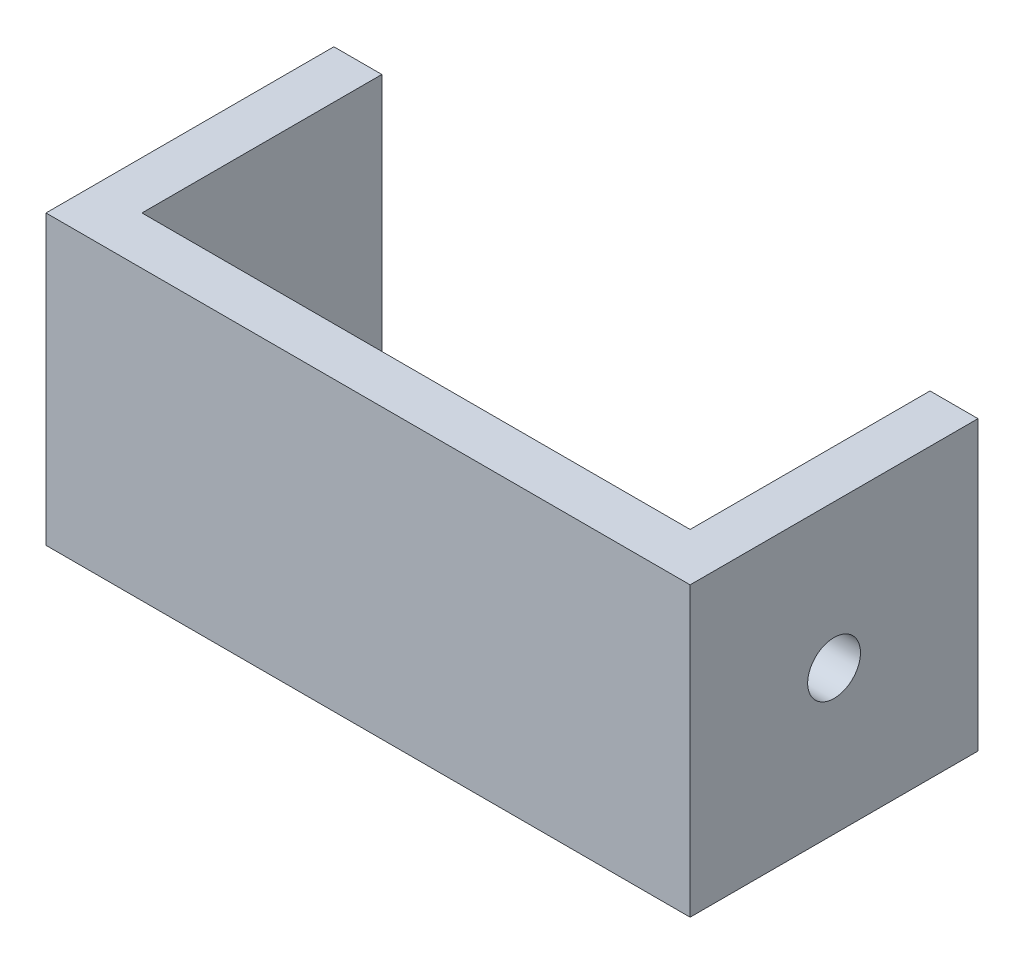
ISO-10303-21;
HEADER;
FILE_DESCRIPTION(('STEP AP214'),'2;1');
FILE_NAME('part.step','',(''),(''),'','','');
FILE_SCHEMA(('AUTOMOTIVE_DESIGN { 1 0 10303 214 1 1 1 1 }'));
ENDSEC;
DATA;
#1=APPLICATION_CONTEXT('core data for automotive mechanical design processes');
#2=APPLICATION_PROTOCOL_DEFINITION('international standard','automotive_design',2000,#1);
#3=PRODUCT_CONTEXT('',#1,'mechanical');
#4=PRODUCT('Part','Part','',(#3));
#5=PRODUCT_RELATED_PRODUCT_CATEGORY('part','',(#4));
#6=PRODUCT_DEFINITION_FORMATION('','',#4);
#7=PRODUCT_DEFINITION_CONTEXT('part definition',#1,'design');
#8=PRODUCT_DEFINITION('design','',#6,#7);
#9=PRODUCT_DEFINITION_SHAPE('','',#8);
#10=(LENGTH_UNIT() NAMED_UNIT(*) SI_UNIT(.MILLI.,.METRE.));
#11=(NAMED_UNIT(*) PLANE_ANGLE_UNIT() SI_UNIT($,.RADIAN.));
#12=(NAMED_UNIT(*) SI_UNIT($,.STERADIAN.) SOLID_ANGLE_UNIT());
#13=UNCERTAINTY_MEASURE_WITH_UNIT(LENGTH_MEASURE(1.E-05),#10,'distance_accuracy_value','');
#14=(GEOMETRIC_REPRESENTATION_CONTEXT(3) GLOBAL_UNCERTAINTY_ASSIGNED_CONTEXT((#13)) GLOBAL_UNIT_ASSIGNED_CONTEXT((#10,
#11,#12)) REPRESENTATION_CONTEXT('',''));
#15=CARTESIAN_POINT('',(0.,0.,0.));
#16=DIRECTION('',(0.,0.,1.));
#17=DIRECTION('',(1.,0.,0.));
#18=AXIS2_PLACEMENT_3D('',#15,#16,#17);
#19=CARTESIAN_POINT('',(-33.5625,15.,30.));
#20=DIRECTION('',(1.,0.,0.));
#21=DIRECTION('',(0.,0.,-1.));
#22=AXIS2_PLACEMENT_3D('',#19,#20,#21);
#23=PLANE('',#22);
#24=CARTESIAN_POINT('',(-33.5625,0.,15.));
#25=DIRECTION('',(1.,0.,0.));
#26=DIRECTION('',(0.,0.,-1.));
#27=AXIS2_PLACEMENT_3D('',#24,#25,#26);
#28=CIRCLE('',#27,2.75);
#29=CARTESIAN_POINT('',(-33.5625,0.,12.25));
#30=VERTEX_POINT('',#29);
#31=EDGE_CURVE('E236',#30,#30,#28,.T.);
#32=ORIENTED_EDGE('',*,*,#31,.T.);
#33=EDGE_LOOP('',(#32));
#34=FACE_BOUND('',#33,.T.);
#35=DIRECTION('',(0.,-1.,0.));
#36=VECTOR('',#35,1.);
#37=CARTESIAN_POINT('',(-33.5625,15.,0.));
#38=LINE('',#37,#36);
#39=CARTESIAN_POINT('',(-33.5625,15.,0.));
#40=VERTEX_POINT('',#39);
#41=CARTESIAN_POINT('',(-33.5625,-15.,0.));
#42=VERTEX_POINT('',#41);
#43=EDGE_CURVE('E165',#40,#42,#38,.T.);
#44=ORIENTED_EDGE('',*,*,#43,.T.);
#45=DIRECTION('',(0.,0.,-1.));
#46=VECTOR('',#45,1.);
#47=CARTESIAN_POINT('',(-33.5625,-15.,30.));
#48=LINE('',#47,#46);
#49=CARTESIAN_POINT('',(-33.5625,-15.,30.));
#50=VERTEX_POINT('',#49);
#51=EDGE_CURVE('E11',#50,#42,#48,.T.);
#52=ORIENTED_EDGE('',*,*,#51,.F.);
#53=DIRECTION('',(0.,-1.,0.));
#54=VECTOR('',#53,1.);
#55=CARTESIAN_POINT('',(-33.5625,15.,30.));
#56=LINE('',#55,#54);
#57=CARTESIAN_POINT('',(-33.5625,15.,30.));
#58=VERTEX_POINT('',#57);
#59=EDGE_CURVE('E171',#58,#50,#56,.T.);
#60=ORIENTED_EDGE('',*,*,#59,.F.);
#61=DIRECTION('',(0.,0.,-1.));
#62=VECTOR('',#61,1.);
#63=CARTESIAN_POINT('',(-33.5625,15.,30.));
#64=LINE('',#63,#62);
#65=EDGE_CURVE('E182',#58,#40,#64,.T.);
#66=ORIENTED_EDGE('',*,*,#65,.T.);
#67=EDGE_LOOP('',(#44,#52,#60,#66));
#68=FACE_BOUND('',#67,.T.);
#69=ADVANCED_FACE('F45',(#34,#68),#23,.F.);
#70=CARTESIAN_POINT('',(33.5625,-15.,30.));
#71=DIRECTION('',(0.,1.,0.));
#72=DIRECTION('',(0.,0.,1.));
#73=AXIS2_PLACEMENT_3D('',#70,#71,#72);
#74=PLANE('',#73);
#75=DIRECTION('',(1.,0.,0.));
#76=VECTOR('',#75,1.);
#77=CARTESIAN_POINT('',(33.5625,-15.,0.));
#78=LINE('',#77,#76);
#79=CARTESIAN_POINT('',(33.5625,-15.,0.));
#80=VERTEX_POINT('',#79);
#81=EDGE_CURVE('E186',#42,#80,#78,.T.);
#82=ORIENTED_EDGE('',*,*,#81,.T.);
#83=DIRECTION('',(0.,0.,-1.));
#84=VECTOR('',#83,1.);
#85=CARTESIAN_POINT('',(33.5625,-15.,30.));
#86=LINE('',#85,#84);
#87=CARTESIAN_POINT('',(33.5625,-15.,30.));
#88=VERTEX_POINT('',#87);
#89=EDGE_CURVE('E54',#88,#80,#86,.T.);
#90=ORIENTED_EDGE('',*,*,#89,.F.);
#91=DIRECTION('',(1.,0.,0.));
#92=VECTOR('',#91,1.);
#93=CARTESIAN_POINT('',(33.5625,-15.,30.));
#94=LINE('',#93,#92);
#95=EDGE_CURVE('E98',#50,#88,#94,.T.);
#96=ORIENTED_EDGE('',*,*,#95,.F.);
#97=ORIENTED_EDGE('',*,*,#51,.T.);
#98=EDGE_LOOP('',(#82,#90,#96,#97));
#99=FACE_BOUND('',#98,.T.);
#100=ADVANCED_FACE('F229',(#99),#74,.F.);
#101=CARTESIAN_POINT('',(33.5625,15.,30.));
#102=DIRECTION('',(-1.,0.,0.));
#103=DIRECTION('',(0.,0.,1.));
#104=AXIS2_PLACEMENT_3D('',#101,#102,#103);
#105=PLANE('',#104);
#106=CARTESIAN_POINT('',(33.5625,0.,15.));
#107=DIRECTION('',(1.,0.,0.));
#108=DIRECTION('',(0.,0.,-1.));
#109=AXIS2_PLACEMENT_3D('',#106,#107,#108);
#110=CIRCLE('',#109,2.75);
#111=CARTESIAN_POINT('',(33.5625,0.,12.25));
#112=VERTEX_POINT('',#111);
#113=EDGE_CURVE('E239',#112,#112,#110,.T.);
#114=ORIENTED_EDGE('',*,*,#113,.F.);
#115=EDGE_LOOP('',(#114));
#116=FACE_BOUND('',#115,.T.);
#117=DIRECTION('',(0.,1.,0.));
#118=VECTOR('',#117,1.);
#119=CARTESIAN_POINT('',(33.5625,15.,0.));
#120=LINE('',#119,#118);
#121=CARTESIAN_POINT('',(33.5625,15.,0.));
#122=VERTEX_POINT('',#121);
#123=EDGE_CURVE('E189',#80,#122,#120,.T.);
#124=ORIENTED_EDGE('',*,*,#123,.T.);
#125=DIRECTION('',(0.,0.,-1.));
#126=VECTOR('',#125,1.);
#127=CARTESIAN_POINT('',(33.5625,15.,30.));
#128=LINE('',#127,#126);
#129=CARTESIAN_POINT('',(33.5625,15.,30.));
#130=VERTEX_POINT('',#129);
#131=EDGE_CURVE('E197',#130,#122,#128,.T.);
#132=ORIENTED_EDGE('',*,*,#131,.F.);
#133=DIRECTION('',(0.,1.,0.));
#134=VECTOR('',#133,1.);
#135=CARTESIAN_POINT('',(33.5625,15.,30.));
#136=LINE('',#135,#134);
#137=EDGE_CURVE('E177',#88,#130,#136,.T.);
#138=ORIENTED_EDGE('',*,*,#137,.F.);
#139=ORIENTED_EDGE('',*,*,#89,.T.);
#140=EDGE_LOOP('',(#124,#132,#138,#139));
#141=FACE_BOUND('',#140,.T.);
#142=ADVANCED_FACE('F208',(#116,#141),#105,.F.);
#143=CARTESIAN_POINT('',(33.5625,15.,30.));
#144=DIRECTION('',(0.,-1.,0.));
#145=DIRECTION('',(0.,0.,-1.));
#146=AXIS2_PLACEMENT_3D('',#143,#144,#145);
#147=PLANE('',#146);
#148=DIRECTION('',(-1.,0.,0.));
#149=VECTOR('',#148,1.);
#150=CARTESIAN_POINT('',(33.5625,15.,0.));
#151=LINE('',#150,#149);
#152=CARTESIAN_POINT('',(28.5625,15.,0.));
#153=VERTEX_POINT('',#152);
#154=EDGE_CURVE('E174',#122,#153,#151,.T.);
#155=ORIENTED_EDGE('',*,*,#154,.T.);
#156=DIRECTION('',(0.,0.,-1.));
#157=VECTOR('',#156,1.);
#158=CARTESIAN_POINT('',(28.5625,15.,25.));
#159=LINE('',#158,#157);
#160=CARTESIAN_POINT('',(28.5625,15.,25.));
#161=VERTEX_POINT('',#160);
#162=EDGE_CURVE('E162',#161,#153,#159,.T.);
#163=ORIENTED_EDGE('',*,*,#162,.F.);
#164=DIRECTION('',(1.,0.,0.));
#165=VECTOR('',#164,1.);
#166=CARTESIAN_POINT('',(28.5625,15.,25.));
#167=LINE('',#166,#165);
#168=CARTESIAN_POINT('',(-28.5625,15.,25.));
#169=VERTEX_POINT('',#168);
#170=EDGE_CURVE('E128',#169,#161,#167,.T.);
#171=ORIENTED_EDGE('',*,*,#170,.F.);
#172=DIRECTION('',(0.,0.,-1.));
#173=VECTOR('',#172,1.);
#174=CARTESIAN_POINT('',(-28.5625,15.,25.));
#175=LINE('',#174,#173);
#176=CARTESIAN_POINT('',(-28.5625,15.,0.));
#177=VERTEX_POINT('',#176);
#178=EDGE_CURVE('E166',#169,#177,#175,.T.);
#179=ORIENTED_EDGE('',*,*,#178,.T.);
#180=EDGE_CURVE('E91',#177,#40,#151,.T.);
#181=ORIENTED_EDGE('',*,*,#180,.T.);
#182=ORIENTED_EDGE('',*,*,#65,.F.);
#183=DIRECTION('',(-1.,0.,0.));
#184=VECTOR('',#183,1.);
#185=CARTESIAN_POINT('',(33.5625,15.,30.));
#186=LINE('',#185,#184);
#187=EDGE_CURVE('E70',#130,#58,#186,.T.);
#188=ORIENTED_EDGE('',*,*,#187,.F.);
#189=ORIENTED_EDGE('',*,*,#131,.T.);
#190=EDGE_LOOP('',(#155,#163,#171,#179,#181,#182,#188,#189));
#191=FACE_BOUND('',#190,.T.);
#192=ADVANCED_FACE('F214',(#191),#147,.F.);
#193=CARTESIAN_POINT('',(0.,0.,30.));
#194=DIRECTION('',(0.,0.,-1.));
#195=DIRECTION('',(-1.,0.,0.));
#196=AXIS2_PLACEMENT_3D('',#193,#194,#195);
#197=PLANE('',#196);
#198=ORIENTED_EDGE('',*,*,#59,.T.);
#199=ORIENTED_EDGE('',*,*,#95,.T.);
#200=ORIENTED_EDGE('',*,*,#137,.T.);
#201=ORIENTED_EDGE('',*,*,#187,.T.);
#202=EDGE_LOOP('',(#198,#199,#200,#201));
#203=FACE_BOUND('',#202,.T.);
#204=ADVANCED_FACE('F218',(#203),#197,.F.);
#205=CARTESIAN_POINT('',(0.,0.,0.));
#206=DIRECTION('',(0.,0.,-1.));
#207=DIRECTION('',(-1.,0.,0.));
#208=AXIS2_PLACEMENT_3D('',#205,#206,#207);
#209=PLANE('',#208);
#210=DIRECTION('',(0.,-1.,0.));
#211=VECTOR('',#210,1.);
#212=CARTESIAN_POINT('',(28.5625,15.,0.));
#213=LINE('',#212,#211);
#214=CARTESIAN_POINT('',(28.5625,-10.,0.));
#215=VERTEX_POINT('',#214);
#216=EDGE_CURVE('E61',#153,#215,#213,.T.);
#217=ORIENTED_EDGE('',*,*,#216,.F.);
#218=ORIENTED_EDGE('',*,*,#154,.F.);
#219=ORIENTED_EDGE('',*,*,#123,.F.);
#220=ORIENTED_EDGE('',*,*,#81,.F.);
#221=ORIENTED_EDGE('',*,*,#43,.F.);
#222=ORIENTED_EDGE('',*,*,#180,.F.);
#223=DIRECTION('',(0.,1.,0.));
#224=VECTOR('',#223,1.);
#225=CARTESIAN_POINT('',(-28.5625,15.,0.));
#226=LINE('',#225,#224);
#227=CARTESIAN_POINT('',(-28.5625,-10.,0.));
#228=VERTEX_POINT('',#227);
#229=EDGE_CURVE('E143',#228,#177,#226,.T.);
#230=ORIENTED_EDGE('',*,*,#229,.F.);
#231=DIRECTION('',(-1.,0.,0.));
#232=VECTOR('',#231,1.);
#233=CARTESIAN_POINT('',(28.5625,-10.,0.));
#234=LINE('',#233,#232);
#235=EDGE_CURVE('E148',#215,#228,#234,.T.);
#236=ORIENTED_EDGE('',*,*,#235,.F.);
#237=EDGE_LOOP('',(#217,#218,#219,#220,#221,#222,#230,#236));
#238=FACE_BOUND('',#237,.T.);
#239=ADVANCED_FACE('F212',(#238),#209,.T.);
#240=CARTESIAN_POINT('',(28.5625,15.,25.));
#241=DIRECTION('',(1.,0.,0.));
#242=DIRECTION('',(0.,1.,0.));
#243=AXIS2_PLACEMENT_3D('',#240,#241,#242);
#244=PLANE('',#243);
#245=CARTESIAN_POINT('',(28.5625,0.,15.));
#246=DIRECTION('',(1.,0.,0.));
#247=DIRECTION('',(0.,1.,0.));
#248=AXIS2_PLACEMENT_3D('',#245,#246,#247);
#249=CIRCLE('',#248,2.75);
#250=CARTESIAN_POINT('',(28.5625,2.75,15.));
#251=VERTEX_POINT('',#250);
#252=EDGE_CURVE('E151',#251,#251,#249,.T.);
#253=ORIENTED_EDGE('',*,*,#252,.T.);
#254=EDGE_LOOP('',(#253));
#255=FACE_BOUND('',#254,.T.);
#256=ORIENTED_EDGE('',*,*,#216,.T.);
#257=DIRECTION('',(0.,0.,-1.));
#258=VECTOR('',#257,1.);
#259=CARTESIAN_POINT('',(28.5625,-10.,25.));
#260=LINE('',#259,#258);
#261=CARTESIAN_POINT('',(28.5625,-10.,25.));
#262=VERTEX_POINT('',#261);
#263=EDGE_CURVE('E117',#262,#215,#260,.T.);
#264=ORIENTED_EDGE('',*,*,#263,.F.);
#265=DIRECTION('',(0.,-1.,0.));
#266=VECTOR('',#265,1.);
#267=CARTESIAN_POINT('',(28.5625,15.,25.));
#268=LINE('',#267,#266);
#269=EDGE_CURVE('E121',#161,#262,#268,.T.);
#270=ORIENTED_EDGE('',*,*,#269,.F.);
#271=ORIENTED_EDGE('',*,*,#162,.T.);
#272=EDGE_LOOP('',(#256,#264,#270,#271));
#273=FACE_BOUND('',#272,.T.);
#274=ADVANCED_FACE('F119',(#255,#273),#244,.F.);
#275=CARTESIAN_POINT('',(-28.5625,15.,25.));
#276=DIRECTION('',(-1.,0.,0.));
#277=DIRECTION('',(0.,-1.,0.));
#278=AXIS2_PLACEMENT_3D('',#275,#276,#277);
#279=PLANE('',#278);
#280=CARTESIAN_POINT('',(-28.5625,0.,15.));
#281=DIRECTION('',(-1.,0.,0.));
#282=DIRECTION('',(0.,-1.,0.));
#283=AXIS2_PLACEMENT_3D('',#280,#281,#282);
#284=CIRCLE('',#283,2.75);
#285=CARTESIAN_POINT('',(-28.5625,-2.75,15.));
#286=VERTEX_POINT('',#285);
#287=EDGE_CURVE('E48',#286,#286,#284,.T.);
#288=ORIENTED_EDGE('',*,*,#287,.T.);
#289=EDGE_LOOP('',(#288));
#290=FACE_BOUND('',#289,.T.);
#291=ORIENTED_EDGE('',*,*,#229,.T.);
#292=ORIENTED_EDGE('',*,*,#178,.F.);
#293=DIRECTION('',(0.,1.,0.));
#294=VECTOR('',#293,1.);
#295=CARTESIAN_POINT('',(-28.5625,15.,25.));
#296=LINE('',#295,#294);
#297=CARTESIAN_POINT('',(-28.5625,-10.,25.));
#298=VERTEX_POINT('',#297);
#299=EDGE_CURVE('E137',#298,#169,#296,.T.);
#300=ORIENTED_EDGE('',*,*,#299,.F.);
#301=DIRECTION('',(0.,0.,-1.));
#302=VECTOR('',#301,1.);
#303=CARTESIAN_POINT('',(-28.5625,-10.,25.));
#304=LINE('',#303,#302);
#305=EDGE_CURVE('E127',#298,#228,#304,.T.);
#306=ORIENTED_EDGE('',*,*,#305,.T.);
#307=EDGE_LOOP('',(#291,#292,#300,#306));
#308=FACE_BOUND('',#307,.T.);
#309=ADVANCED_FACE('F286',(#290,#308),#279,.F.);
#310=CARTESIAN_POINT('',(28.5625,-10.,25.));
#311=DIRECTION('',(0.,-1.,0.));
#312=DIRECTION('',(0.,0.,-1.));
#313=AXIS2_PLACEMENT_3D('',#310,#311,#312);
#314=PLANE('',#313);
#315=ORIENTED_EDGE('',*,*,#235,.T.);
#316=ORIENTED_EDGE('',*,*,#305,.F.);
#317=DIRECTION('',(-1.,0.,0.));
#318=VECTOR('',#317,1.);
#319=CARTESIAN_POINT('',(28.5625,-10.,25.));
#320=LINE('',#319,#318);
#321=EDGE_CURVE('E131',#262,#298,#320,.T.);
#322=ORIENTED_EDGE('',*,*,#321,.F.);
#323=ORIENTED_EDGE('',*,*,#263,.T.);
#324=EDGE_LOOP('',(#315,#316,#322,#323));
#325=FACE_BOUND('',#324,.T.);
#326=ADVANCED_FACE('F132',(#325),#314,.F.);
#327=CARTESIAN_POINT('',(0.,0.,25.));
#328=DIRECTION('',(0.,0.,-1.));
#329=DIRECTION('',(-1.,0.,0.));
#330=AXIS2_PLACEMENT_3D('',#327,#328,#329);
#331=PLANE('',#330);
#332=ORIENTED_EDGE('',*,*,#269,.T.);
#333=ORIENTED_EDGE('',*,*,#321,.T.);
#334=ORIENTED_EDGE('',*,*,#299,.T.);
#335=ORIENTED_EDGE('',*,*,#170,.T.);
#336=EDGE_LOOP('',(#332,#333,#334,#335));
#337=FACE_BOUND('',#336,.T.);
#338=ADVANCED_FACE('F139',(#337),#331,.T.);
#339=CARTESIAN_POINT('',(-33.5625,0.,15.));
#340=DIRECTION('',(1.,0.,0.));
#341=DIRECTION('',(0.,0.,-1.));
#342=AXIS2_PLACEMENT_3D('',#339,#340,#341);
#343=CYLINDRICAL_SURFACE('',#342,2.75);
#344=ORIENTED_EDGE('',*,*,#31,.F.);
#345=EDGE_LOOP('',(#344));
#346=FACE_BOUND('',#345,.T.);
#347=ORIENTED_EDGE('',*,*,#287,.F.);
#348=EDGE_LOOP('',(#347));
#349=FACE_BOUND('',#348,.T.);
#350=ADVANCED_FACE('F297',(#346,#349),#343,.F.);
#351=ORIENTED_EDGE('',*,*,#113,.T.);
#352=EDGE_LOOP('',(#351));
#353=FACE_BOUND('',#352,.T.);
#354=ORIENTED_EDGE('',*,*,#252,.F.);
#355=EDGE_LOOP('',(#354));
#356=FACE_BOUND('',#355,.T.);
#357=ADVANCED_FACE('F251',(#353,#356),#343,.F.);
#358=CLOSED_SHELL('',(#69,#100,#142,#192,#204,#239,#274,#309,#326,#338,#350,#357));
#359=MANIFOLD_SOLID_BREP('B2',#358);
#360=ADVANCED_BREP_SHAPE_REPRESENTATION('',(#18,#359),#14);
#361=SHAPE_DEFINITION_REPRESENTATION(#9,#360);
ENDSEC;
END-ISO-10303-21;
